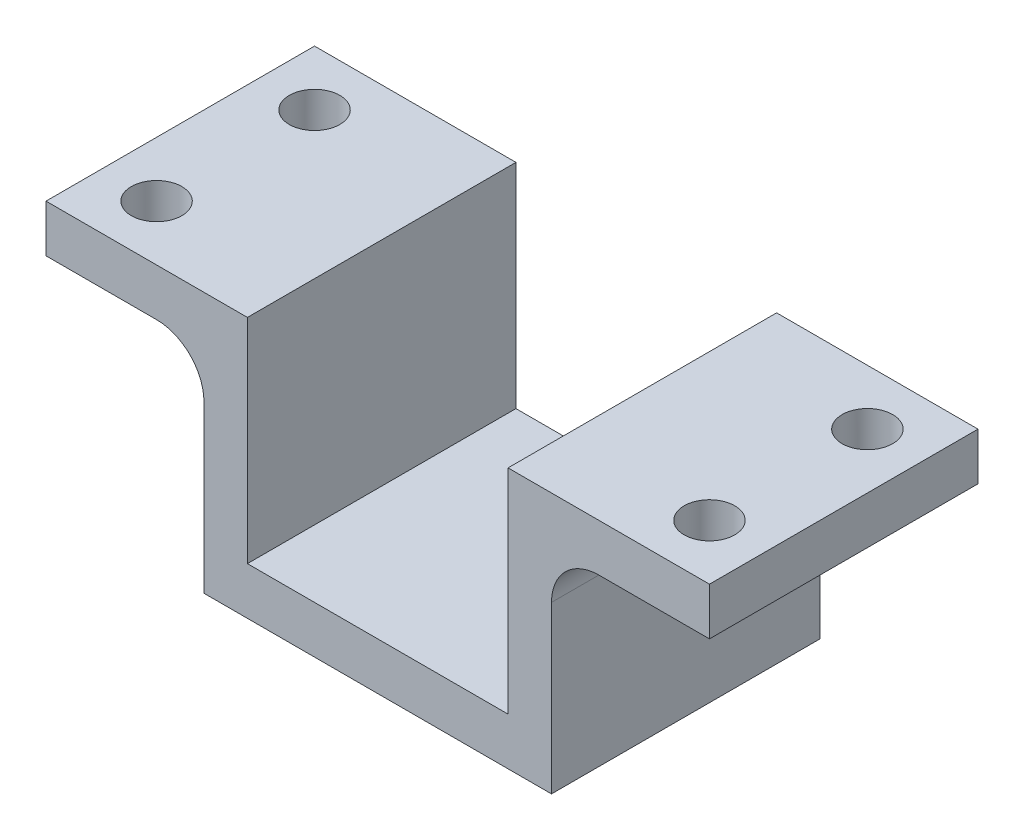
ISO-10303-21;
HEADER;
FILE_DESCRIPTION(('STEP AP214'),'2;1');
FILE_NAME('part.step','',(''),(''),'','','');
FILE_SCHEMA(('AUTOMOTIVE_DESIGN { 1 0 10303 214 1 1 1 1 }'));
ENDSEC;
DATA;
#1=APPLICATION_CONTEXT('core data for automotive mechanical design processes');
#2=APPLICATION_PROTOCOL_DEFINITION('international standard','automotive_design',2000,#1);
#3=PRODUCT_CONTEXT('',#1,'mechanical');
#4=PRODUCT('Part','Part','',(#3));
#5=PRODUCT_RELATED_PRODUCT_CATEGORY('part','',(#4));
#6=PRODUCT_DEFINITION_FORMATION('','',#4);
#7=PRODUCT_DEFINITION_CONTEXT('part definition',#1,'design');
#8=PRODUCT_DEFINITION('design','',#6,#7);
#9=PRODUCT_DEFINITION_SHAPE('','',#8);
#10=(LENGTH_UNIT() NAMED_UNIT(*) SI_UNIT(.MILLI.,.METRE.));
#11=(NAMED_UNIT(*) PLANE_ANGLE_UNIT() SI_UNIT($,.RADIAN.));
#12=(NAMED_UNIT(*) SI_UNIT($,.STERADIAN.) SOLID_ANGLE_UNIT());
#13=UNCERTAINTY_MEASURE_WITH_UNIT(LENGTH_MEASURE(1.E-05),#10,'distance_accuracy_value','');
#14=(GEOMETRIC_REPRESENTATION_CONTEXT(3) GLOBAL_UNCERTAINTY_ASSIGNED_CONTEXT((#13)) GLOBAL_UNIT_ASSIGNED_CONTEXT((#10,
#11,#12)) REPRESENTATION_CONTEXT('',''));
#15=CARTESIAN_POINT('',(0.,0.,0.));
#16=DIRECTION('',(0.,0.,1.));
#17=DIRECTION('',(1.,0.,0.));
#18=AXIS2_PLACEMENT_3D('',#15,#16,#17);
#19=CARTESIAN_POINT('',(0.,3.,0.));
#20=DIRECTION('',(0.,-1.,0.));
#21=DIRECTION('',(0.,0.,-1.));
#22=AXIS2_PLACEMENT_3D('',#19,#20,#21);
#23=PLANE('',#22);
#24=DIRECTION('',(0.,0.,1.));
#25=VECTOR('',#24,1.);
#26=CARTESIAN_POINT('',(8.25,3.,-8.5));
#27=LINE('',#26,#25);
#28=CARTESIAN_POINT('',(8.25,3.,-8.5));
#29=VERTEX_POINT('',#28);
#30=CARTESIAN_POINT('',(8.25,3.,8.5));
#31=VERTEX_POINT('',#30);
#32=EDGE_CURVE('E174',#29,#31,#27,.T.);
#33=ORIENTED_EDGE('',*,*,#32,.F.);
#34=DIRECTION('',(-1.,0.,0.));
#35=VECTOR('',#34,1.);
#36=CARTESIAN_POINT('',(-11.,3.,-8.5));
#37=LINE('',#36,#35);
#38=CARTESIAN_POINT('',(-8.25,3.,-8.5));
#39=VERTEX_POINT('',#38);
#40=EDGE_CURVE('E207',#29,#39,#37,.T.);
#41=ORIENTED_EDGE('',*,*,#40,.T.);
#42=DIRECTION('',(0.,0.,-1.));
#43=VECTOR('',#42,1.);
#44=CARTESIAN_POINT('',(-8.25,3.,-8.5));
#45=LINE('',#44,#43);
#46=CARTESIAN_POINT('',(-8.25,3.,8.5));
#47=VERTEX_POINT('',#46);
#48=EDGE_CURVE('E191',#47,#39,#45,.T.);
#49=ORIENTED_EDGE('',*,*,#48,.F.);
#50=DIRECTION('',(1.,0.,0.));
#51=VECTOR('',#50,1.);
#52=CARTESIAN_POINT('',(-11.,3.,8.5));
#53=LINE('',#52,#51);
#54=EDGE_CURVE('E209',#47,#31,#53,.T.);
#55=ORIENTED_EDGE('',*,*,#54,.T.);
#56=EDGE_LOOP('',(#33,#41,#49,#55));
#57=FACE_BOUND('',#56,.T.);
#58=ADVANCED_FACE('F34',(#57),#23,.F.);
#59=CARTESIAN_POINT('',(11.,3.,8.5));
#60=DIRECTION('',(-1.,0.,0.));
#61=DIRECTION('',(0.,0.,1.));
#62=AXIS2_PLACEMENT_3D('',#59,#60,#61);
#63=PLANE('',#62);
#64=DIRECTION('',(0.,-1.,0.));
#65=VECTOR('',#64,1.);
#66=CARTESIAN_POINT('',(11.,3.,-8.5));
#67=LINE('',#66,#65);
#68=CARTESIAN_POINT('',(11.,10.5,-8.5));
#69=VERTEX_POINT('',#68);
#70=CARTESIAN_POINT('',(11.,0.,-8.5));
#71=VERTEX_POINT('',#70);
#72=EDGE_CURVE('E227',#69,#71,#67,.T.);
#73=ORIENTED_EDGE('',*,*,#72,.F.);
#74=DIRECTION('',(0.,0.,1.));
#75=VECTOR('',#74,1.);
#76=CARTESIAN_POINT('',(11.,10.5,8.5));
#77=LINE('',#76,#75);
#78=CARTESIAN_POINT('',(11.,10.5,8.5));
#79=VERTEX_POINT('',#78);
#80=EDGE_CURVE('E229',#69,#79,#77,.T.);
#81=ORIENTED_EDGE('',*,*,#80,.T.);
#82=DIRECTION('',(0.,-1.,0.));
#83=VECTOR('',#82,1.);
#84=CARTESIAN_POINT('',(11.,3.,8.5));
#85=LINE('',#84,#83);
#86=CARTESIAN_POINT('',(11.,0.,8.5));
#87=VERTEX_POINT('',#86);
#88=EDGE_CURVE('E212',#79,#87,#85,.T.);
#89=ORIENTED_EDGE('',*,*,#88,.T.);
#90=DIRECTION('',(0.,0.,-1.));
#91=VECTOR('',#90,1.);
#92=CARTESIAN_POINT('',(11.,0.,8.5));
#93=LINE('',#92,#91);
#94=EDGE_CURVE('E206',#87,#71,#93,.T.);
#95=ORIENTED_EDGE('',*,*,#94,.T.);
#96=EDGE_LOOP('',(#73,#81,#89,#95));
#97=FACE_BOUND('',#96,.T.);
#98=ADVANCED_FACE('F249',(#97),#63,.F.);
#99=CARTESIAN_POINT('',(-11.,3.,-8.5));
#100=DIRECTION('',(0.,0.,1.));
#101=DIRECTION('',(1.,0.,0.));
#102=AXIS2_PLACEMENT_3D('',#99,#100,#101);
#103=PLANE('',#102);
#104=DIRECTION('',(-1.,0.,0.));
#105=VECTOR('',#104,1.);
#106=CARTESIAN_POINT('',(-11.,0.,-8.5));
#107=LINE('',#106,#105);
#108=CARTESIAN_POINT('',(-11.,0.,-8.5));
#109=VERTEX_POINT('',#108);
#110=EDGE_CURVE('E215',#71,#109,#107,.T.);
#111=ORIENTED_EDGE('',*,*,#110,.T.);
#112=DIRECTION('',(0.,-1.,0.));
#113=VECTOR('',#112,1.);
#114=CARTESIAN_POINT('',(-11.,3.,-8.5));
#115=LINE('',#114,#113);
#116=CARTESIAN_POINT('',(-11.,10.5,-8.5));
#117=VERTEX_POINT('',#116);
#118=EDGE_CURVE('E225',#117,#109,#115,.T.);
#119=ORIENTED_EDGE('',*,*,#118,.F.);
#120=CARTESIAN_POINT('',(-14.,10.5,-8.5));
#121=DIRECTION('',(0.,0.,1.));
#122=DIRECTION('',(1.,0.,0.));
#123=AXIS2_PLACEMENT_3D('',#120,#121,#122);
#124=CIRCLE('',#123,3.);
#125=CARTESIAN_POINT('',(-14.,13.5,-8.5));
#126=VERTEX_POINT('',#125);
#127=EDGE_CURVE('E42',#117,#126,#124,.T.);
#128=ORIENTED_EDGE('',*,*,#127,.T.);
#129=DIRECTION('',(-1.,0.,0.));
#130=VECTOR('',#129,1.);
#131=CARTESIAN_POINT('',(-11.,13.5,-8.5));
#132=LINE('',#131,#130);
#133=CARTESIAN_POINT('',(-21.,13.5,-8.5));
#134=VERTEX_POINT('',#133);
#135=EDGE_CURVE('E132',#126,#134,#132,.T.);
#136=ORIENTED_EDGE('',*,*,#135,.T.);
#137=DIRECTION('',(0.,1.,0.));
#138=VECTOR('',#137,1.);
#139=CARTESIAN_POINT('',(-21.,13.5,-8.5));
#140=LINE('',#139,#138);
#141=CARTESIAN_POINT('',(-21.,16.5,-8.5));
#142=VERTEX_POINT('',#141);
#143=EDGE_CURVE('E137',#134,#142,#140,.T.);
#144=ORIENTED_EDGE('',*,*,#143,.T.);
#145=DIRECTION('',(-1.,0.,0.));
#146=VECTOR('',#145,1.);
#147=CARTESIAN_POINT('',(-11.,16.5,-8.5));
#148=LINE('',#147,#146);
#149=CARTESIAN_POINT('',(-8.25,16.5,-8.5));
#150=VERTEX_POINT('',#149);
#151=EDGE_CURVE('E196',#150,#142,#148,.T.);
#152=ORIENTED_EDGE('',*,*,#151,.F.);
#153=DIRECTION('',(0.,-1.,0.));
#154=VECTOR('',#153,1.);
#155=CARTESIAN_POINT('',(-8.25,16.5,-8.5));
#156=LINE('',#155,#154);
#157=EDGE_CURVE('E198',#150,#39,#156,.T.);
#158=ORIENTED_EDGE('',*,*,#157,.T.);
#159=ORIENTED_EDGE('',*,*,#40,.F.);
#160=DIRECTION('',(0.,-1.,0.));
#161=VECTOR('',#160,1.);
#162=CARTESIAN_POINT('',(8.25,16.5,-8.5));
#163=LINE('',#162,#161);
#164=CARTESIAN_POINT('',(8.25,16.5,-8.5));
#165=VERTEX_POINT('',#164);
#166=EDGE_CURVE('E188',#165,#29,#163,.T.);
#167=ORIENTED_EDGE('',*,*,#166,.F.);
#168=DIRECTION('',(-1.,0.,0.));
#169=VECTOR('',#168,1.);
#170=CARTESIAN_POINT('',(11.,16.5,-8.5));
#171=LINE('',#170,#169);
#172=CARTESIAN_POINT('',(21.,16.5,-8.5));
#173=VERTEX_POINT('',#172);
#174=EDGE_CURVE('E177',#173,#165,#171,.T.);
#175=ORIENTED_EDGE('',*,*,#174,.F.);
#176=DIRECTION('',(0.,1.,0.));
#177=VECTOR('',#176,1.);
#178=CARTESIAN_POINT('',(21.,13.5,-8.5));
#179=LINE('',#178,#177);
#180=CARTESIAN_POINT('',(21.,13.5,-8.5));
#181=VERTEX_POINT('',#180);
#182=EDGE_CURVE('E171',#181,#173,#179,.T.);
#183=ORIENTED_EDGE('',*,*,#182,.F.);
#184=DIRECTION('',(-1.,0.,0.));
#185=VECTOR('',#184,1.);
#186=CARTESIAN_POINT('',(11.,13.5,-8.5));
#187=LINE('',#186,#185);
#188=CARTESIAN_POINT('',(14.,13.5,-8.5));
#189=VERTEX_POINT('',#188);
#190=EDGE_CURVE('E165',#181,#189,#187,.T.);
#191=ORIENTED_EDGE('',*,*,#190,.T.);
#192=CARTESIAN_POINT('',(14.,10.5,-8.5));
#193=DIRECTION('',(0.,0.,1.));
#194=DIRECTION('',(1.,0.,0.));
#195=AXIS2_PLACEMENT_3D('',#192,#193,#194);
#196=CIRCLE('',#195,3.);
#197=EDGE_CURVE('E240',#189,#69,#196,.T.);
#198=ORIENTED_EDGE('',*,*,#197,.T.);
#199=ORIENTED_EDGE('',*,*,#72,.T.);
#200=EDGE_LOOP('',(#111,#119,#128,#136,#144,#152,#158,#159,#167,#175,#183,#191,#198,#199));
#201=FACE_BOUND('',#200,.T.);
#202=ADVANCED_FACE('F135',(#201),#103,.F.);
#203=CARTESIAN_POINT('',(-11.,3.,8.5));
#204=DIRECTION('',(1.,0.,0.));
#205=DIRECTION('',(0.,0.,-1.));
#206=AXIS2_PLACEMENT_3D('',#203,#204,#205);
#207=PLANE('',#206);
#208=DIRECTION('',(0.,-1.,0.));
#209=VECTOR('',#208,1.);
#210=CARTESIAN_POINT('',(-11.,3.,8.5));
#211=LINE('',#210,#209);
#212=CARTESIAN_POINT('',(-11.,10.5,8.5));
#213=VERTEX_POINT('',#212);
#214=CARTESIAN_POINT('',(-11.,0.,8.5));
#215=VERTEX_POINT('',#214);
#216=EDGE_CURVE('E223',#213,#215,#211,.T.);
#217=ORIENTED_EDGE('',*,*,#216,.F.);
#218=DIRECTION('',(0.,0.,-1.));
#219=VECTOR('',#218,1.);
#220=CARTESIAN_POINT('',(-11.,10.5,8.5));
#221=LINE('',#220,#219);
#222=EDGE_CURVE('E234',#213,#117,#221,.T.);
#223=ORIENTED_EDGE('',*,*,#222,.T.);
#224=ORIENTED_EDGE('',*,*,#118,.T.);
#225=DIRECTION('',(0.,0.,1.));
#226=VECTOR('',#225,1.);
#227=CARTESIAN_POINT('',(-11.,0.,8.5));
#228=LINE('',#227,#226);
#229=EDGE_CURVE('E217',#109,#215,#228,.T.);
#230=ORIENTED_EDGE('',*,*,#229,.T.);
#231=EDGE_LOOP('',(#217,#223,#224,#230));
#232=FACE_BOUND('',#231,.T.);
#233=ADVANCED_FACE('F305',(#232),#207,.F.);
#234=CARTESIAN_POINT('',(-11.,3.,8.5));
#235=DIRECTION('',(0.,0.,-1.));
#236=DIRECTION('',(-1.,0.,0.));
#237=AXIS2_PLACEMENT_3D('',#234,#235,#236);
#238=PLANE('',#237);
#239=DIRECTION('',(1.,0.,0.));
#240=VECTOR('',#239,1.);
#241=CARTESIAN_POINT('',(-11.,0.,8.5));
#242=LINE('',#241,#240);
#243=EDGE_CURVE('E210',#215,#87,#242,.T.);
#244=ORIENTED_EDGE('',*,*,#243,.T.);
#245=ORIENTED_EDGE('',*,*,#88,.F.);
#246=CARTESIAN_POINT('',(14.,10.5,8.5));
#247=DIRECTION('',(0.,0.,-1.));
#248=DIRECTION('',(-1.,0.,0.));
#249=AXIS2_PLACEMENT_3D('',#246,#247,#248);
#250=CIRCLE('',#249,3.);
#251=CARTESIAN_POINT('',(14.,13.5,8.5));
#252=VERTEX_POINT('',#251);
#253=EDGE_CURVE('E238',#79,#252,#250,.T.);
#254=ORIENTED_EDGE('',*,*,#253,.T.);
#255=DIRECTION('',(1.,0.,0.));
#256=VECTOR('',#255,1.);
#257=CARTESIAN_POINT('',(11.,13.5,8.5));
#258=LINE('',#257,#256);
#259=CARTESIAN_POINT('',(21.,13.5,8.5));
#260=VERTEX_POINT('',#259);
#261=EDGE_CURVE('E160',#252,#260,#258,.T.);
#262=ORIENTED_EDGE('',*,*,#261,.T.);
#263=DIRECTION('',(0.,1.,0.));
#264=VECTOR('',#263,1.);
#265=CARTESIAN_POINT('',(21.,13.5,8.5));
#266=LINE('',#265,#264);
#267=CARTESIAN_POINT('',(21.,16.5,8.5));
#268=VERTEX_POINT('',#267);
#269=EDGE_CURVE('E168',#260,#268,#266,.T.);
#270=ORIENTED_EDGE('',*,*,#269,.T.);
#271=DIRECTION('',(1.,0.,0.));
#272=VECTOR('',#271,1.);
#273=CARTESIAN_POINT('',(11.,16.5,8.5));
#274=LINE('',#273,#272);
#275=CARTESIAN_POINT('',(8.25,16.5,8.5));
#276=VERTEX_POINT('',#275);
#277=EDGE_CURVE('E181',#276,#268,#274,.T.);
#278=ORIENTED_EDGE('',*,*,#277,.F.);
#279=DIRECTION('',(0.,-1.,0.));
#280=VECTOR('',#279,1.);
#281=CARTESIAN_POINT('',(8.25,16.5,8.5));
#282=LINE('',#281,#280);
#283=EDGE_CURVE('E183',#276,#31,#282,.T.);
#284=ORIENTED_EDGE('',*,*,#283,.T.);
#285=ORIENTED_EDGE('',*,*,#54,.F.);
#286=DIRECTION('',(0.,-1.,0.));
#287=VECTOR('',#286,1.);
#288=CARTESIAN_POINT('',(-8.25,16.5,8.5));
#289=LINE('',#288,#287);
#290=CARTESIAN_POINT('',(-8.25,16.5,8.5));
#291=VERTEX_POINT('',#290);
#292=EDGE_CURVE('E203',#291,#47,#289,.T.);
#293=ORIENTED_EDGE('',*,*,#292,.F.);
#294=DIRECTION('',(1.,0.,0.));
#295=VECTOR('',#294,1.);
#296=CARTESIAN_POINT('',(-11.,16.5,8.5));
#297=LINE('',#296,#295);
#298=CARTESIAN_POINT('',(-21.,16.5,8.5));
#299=VERTEX_POINT('',#298);
#300=EDGE_CURVE('E192',#299,#291,#297,.T.);
#301=ORIENTED_EDGE('',*,*,#300,.F.);
#302=DIRECTION('',(0.,1.,0.));
#303=VECTOR('',#302,1.);
#304=CARTESIAN_POINT('',(-21.,13.5,8.5));
#305=LINE('',#304,#303);
#306=CARTESIAN_POINT('',(-21.,13.5,8.5));
#307=VERTEX_POINT('',#306);
#308=EDGE_CURVE('E148',#307,#299,#305,.T.);
#309=ORIENTED_EDGE('',*,*,#308,.F.);
#310=DIRECTION('',(1.,0.,0.));
#311=VECTOR('',#310,1.);
#312=CARTESIAN_POINT('',(-11.,13.5,8.5));
#313=LINE('',#312,#311);
#314=CARTESIAN_POINT('',(-14.,13.5,8.5));
#315=VERTEX_POINT('',#314);
#316=EDGE_CURVE('E149',#307,#315,#313,.T.);
#317=ORIENTED_EDGE('',*,*,#316,.T.);
#318=CARTESIAN_POINT('',(-14.,10.5,8.5));
#319=DIRECTION('',(0.,0.,-1.));
#320=DIRECTION('',(-1.,0.,0.));
#321=AXIS2_PLACEMENT_3D('',#318,#319,#320);
#322=CIRCLE('',#321,3.);
#323=EDGE_CURVE('E11',#315,#213,#322,.T.);
#324=ORIENTED_EDGE('',*,*,#323,.T.);
#325=ORIENTED_EDGE('',*,*,#216,.T.);
#326=EDGE_LOOP('',(#244,#245,#254,#262,#270,#278,#284,#285,#293,#301,#309,#317,#324,#325));
#327=FACE_BOUND('',#326,.T.);
#328=ADVANCED_FACE('F255',(#327),#238,.F.);
#329=CARTESIAN_POINT('',(0.,0.,0.));
#330=DIRECTION('',(0.,-1.,0.));
#331=DIRECTION('',(0.,0.,-1.));
#332=AXIS2_PLACEMENT_3D('',#329,#330,#331);
#333=PLANE('',#332);
#334=ORIENTED_EDGE('',*,*,#94,.F.);
#335=ORIENTED_EDGE('',*,*,#243,.F.);
#336=ORIENTED_EDGE('',*,*,#229,.F.);
#337=ORIENTED_EDGE('',*,*,#110,.F.);
#338=EDGE_LOOP('',(#334,#335,#336,#337));
#339=FACE_BOUND('',#338,.T.);
#340=ADVANCED_FACE('F289',(#339),#333,.T.);
#341=CARTESIAN_POINT('',(-8.25,16.5,-8.5));
#342=DIRECTION('',(-1.,0.,0.));
#343=DIRECTION('',(0.,0.,1.));
#344=AXIS2_PLACEMENT_3D('',#341,#342,#343);
#345=PLANE('',#344);
#346=ORIENTED_EDGE('',*,*,#48,.T.);
#347=ORIENTED_EDGE('',*,*,#157,.F.);
#348=DIRECTION('',(0.,0.,-1.));
#349=VECTOR('',#348,1.);
#350=CARTESIAN_POINT('',(-8.25,16.5,-8.5));
#351=LINE('',#350,#349);
#352=EDGE_CURVE('E194',#291,#150,#351,.T.);
#353=ORIENTED_EDGE('',*,*,#352,.F.);
#354=ORIENTED_EDGE('',*,*,#292,.T.);
#355=EDGE_LOOP('',(#346,#347,#353,#354));
#356=FACE_BOUND('',#355,.T.);
#357=ADVANCED_FACE('F277',(#356),#345,.F.);
#358=CARTESIAN_POINT('',(0.,16.5,0.));
#359=DIRECTION('',(0.,1.,0.));
#360=DIRECTION('',(0.,0.,1.));
#361=AXIS2_PLACEMENT_3D('',#358,#359,#360);
#362=PLANE('',#361);
#363=CARTESIAN_POINT('',(-17.5,16.5,5.));
#364=DIRECTION('',(0.,1.,0.));
#365=DIRECTION('',(0.,0.,-1.));
#366=AXIS2_PLACEMENT_3D('',#363,#364,#365);
#367=CIRCLE('',#366,1.6);
#368=CARTESIAN_POINT('',(-17.5,16.5,3.4));
#369=VERTEX_POINT('',#368);
#370=EDGE_CURVE('E369',#369,#369,#367,.T.);
#371=ORIENTED_EDGE('',*,*,#370,.F.);
#372=EDGE_LOOP('',(#371));
#373=FACE_BOUND('',#372,.T.);
#374=CARTESIAN_POINT('',(-17.5,16.5,-5.));
#375=DIRECTION('',(0.,1.,0.));
#376=DIRECTION('',(0.,0.,1.));
#377=AXIS2_PLACEMENT_3D('',#374,#375,#376);
#378=CIRCLE('',#377,1.6);
#379=CARTESIAN_POINT('',(-17.5,16.5,-3.4));
#380=VERTEX_POINT('',#379);
#381=EDGE_CURVE('E157',#380,#380,#378,.T.);
#382=ORIENTED_EDGE('',*,*,#381,.F.);
#383=EDGE_LOOP('',(#382));
#384=FACE_BOUND('',#383,.T.);
#385=ORIENTED_EDGE('',*,*,#151,.T.);
#386=DIRECTION('',(0.,0.,1.));
#387=VECTOR('',#386,1.);
#388=CARTESIAN_POINT('',(-21.,16.5,-8.5));
#389=LINE('',#388,#387);
#390=EDGE_CURVE('E141',#142,#299,#389,.T.);
#391=ORIENTED_EDGE('',*,*,#390,.T.);
#392=ORIENTED_EDGE('',*,*,#300,.T.);
#393=ORIENTED_EDGE('',*,*,#352,.T.);
#394=EDGE_LOOP('',(#385,#391,#392,#393));
#395=FACE_BOUND('',#394,.T.);
#396=ADVANCED_FACE('F280',(#373,#384,#395),#362,.T.);
#397=CARTESIAN_POINT('',(8.25,16.5,-8.5));
#398=DIRECTION('',(1.,0.,0.));
#399=DIRECTION('',(0.,0.,-1.));
#400=AXIS2_PLACEMENT_3D('',#397,#398,#399);
#401=PLANE('',#400);
#402=ORIENTED_EDGE('',*,*,#32,.T.);
#403=ORIENTED_EDGE('',*,*,#283,.F.);
#404=DIRECTION('',(0.,0.,1.));
#405=VECTOR('',#404,1.);
#406=CARTESIAN_POINT('',(8.25,16.5,-8.5));
#407=LINE('',#406,#405);
#408=EDGE_CURVE('E179',#165,#276,#407,.T.);
#409=ORIENTED_EDGE('',*,*,#408,.F.);
#410=ORIENTED_EDGE('',*,*,#166,.T.);
#411=EDGE_LOOP('',(#402,#403,#409,#410));
#412=FACE_BOUND('',#411,.T.);
#413=ADVANCED_FACE('F271',(#412),#401,.F.);
#414=CARTESIAN_POINT('',(0.,16.5,0.));
#415=DIRECTION('',(0.,-1.,0.));
#416=DIRECTION('',(0.,0.,-1.));
#417=AXIS2_PLACEMENT_3D('',#414,#415,#416);
#418=PLANE('',#417);
#419=CARTESIAN_POINT('',(17.5,16.5,-5.));
#420=DIRECTION('',(0.,1.,0.));
#421=DIRECTION('',(0.,0.,-1.));
#422=AXIS2_PLACEMENT_3D('',#419,#420,#421);
#423=CIRCLE('',#422,1.6);
#424=CARTESIAN_POINT('',(17.5,16.5,-6.6));
#425=VERTEX_POINT('',#424);
#426=EDGE_CURVE('E350',#425,#425,#423,.T.);
#427=ORIENTED_EDGE('',*,*,#426,.F.);
#428=EDGE_LOOP('',(#427));
#429=FACE_BOUND('',#428,.T.);
#430=CARTESIAN_POINT('',(17.5,16.5,5.));
#431=DIRECTION('',(0.,1.,0.));
#432=DIRECTION('',(0.,0.,1.));
#433=AXIS2_PLACEMENT_3D('',#430,#431,#432);
#434=CIRCLE('',#433,1.6);
#435=CARTESIAN_POINT('',(17.5,16.5,6.6));
#436=VERTEX_POINT('',#435);
#437=EDGE_CURVE('E353',#436,#436,#434,.T.);
#438=ORIENTED_EDGE('',*,*,#437,.F.);
#439=EDGE_LOOP('',(#438));
#440=FACE_BOUND('',#439,.T.);
#441=ORIENTED_EDGE('',*,*,#277,.T.);
#442=DIRECTION('',(0.,0.,-1.));
#443=VECTOR('',#442,1.);
#444=CARTESIAN_POINT('',(21.,16.5,-8.5));
#445=LINE('',#444,#443);
#446=EDGE_CURVE('E158',#268,#173,#445,.T.);
#447=ORIENTED_EDGE('',*,*,#446,.T.);
#448=ORIENTED_EDGE('',*,*,#174,.T.);
#449=ORIENTED_EDGE('',*,*,#408,.T.);
#450=EDGE_LOOP('',(#441,#447,#448,#449));
#451=FACE_BOUND('',#450,.T.);
#452=ADVANCED_FACE('F267',(#429,#440,#451),#418,.F.);
#453=CARTESIAN_POINT('',(21.,13.5,-8.5));
#454=DIRECTION('',(1.,0.,0.));
#455=DIRECTION('',(0.,0.,-1.));
#456=AXIS2_PLACEMENT_3D('',#453,#454,#455);
#457=PLANE('',#456);
#458=ORIENTED_EDGE('',*,*,#446,.F.);
#459=ORIENTED_EDGE('',*,*,#269,.F.);
#460=DIRECTION('',(0.,0.,-1.));
#461=VECTOR('',#460,1.);
#462=CARTESIAN_POINT('',(21.,13.5,-8.5));
#463=LINE('',#462,#461);
#464=EDGE_CURVE('E162',#260,#181,#463,.T.);
#465=ORIENTED_EDGE('',*,*,#464,.T.);
#466=ORIENTED_EDGE('',*,*,#182,.T.);
#467=EDGE_LOOP('',(#458,#459,#465,#466));
#468=FACE_BOUND('',#467,.T.);
#469=ADVANCED_FACE('F262',(#468),#457,.T.);
#470=CARTESIAN_POINT('',(0.,13.5,0.));
#471=DIRECTION('',(0.,1.,0.));
#472=DIRECTION('',(0.,0.,1.));
#473=AXIS2_PLACEMENT_3D('',#470,#471,#472);
#474=PLANE('',#473);
#475=CARTESIAN_POINT('',(17.5,13.5,-5.));
#476=DIRECTION('',(0.,1.,0.));
#477=DIRECTION('',(0.,0.,1.));
#478=AXIS2_PLACEMENT_3D('',#475,#476,#477);
#479=CIRCLE('',#478,1.6);
#480=CARTESIAN_POINT('',(17.5,13.5,-3.4));
#481=VERTEX_POINT('',#480);
#482=EDGE_CURVE('E355',#481,#481,#479,.F.);
#483=ORIENTED_EDGE('',*,*,#482,.F.);
#484=EDGE_LOOP('',(#483));
#485=FACE_BOUND('',#484,.T.);
#486=CARTESIAN_POINT('',(17.5,13.5,5.));
#487=DIRECTION('',(0.,1.,0.));
#488=DIRECTION('',(0.,0.,1.));
#489=AXIS2_PLACEMENT_3D('',#486,#487,#488);
#490=CIRCLE('',#489,1.6);
#491=CARTESIAN_POINT('',(17.5,13.5,6.6));
#492=VERTEX_POINT('',#491);
#493=EDGE_CURVE('E354',#492,#492,#490,.F.);
#494=ORIENTED_EDGE('',*,*,#493,.F.);
#495=EDGE_LOOP('',(#494));
#496=FACE_BOUND('',#495,.T.);
#497=ORIENTED_EDGE('',*,*,#261,.F.);
#498=DIRECTION('',(0.,0.,1.));
#499=VECTOR('',#498,1.);
#500=CARTESIAN_POINT('',(14.,13.5,-8.5));
#501=LINE('',#500,#499);
#502=EDGE_CURVE('E232',#252,#189,#501,.F.);
#503=ORIENTED_EDGE('',*,*,#502,.T.);
#504=ORIENTED_EDGE('',*,*,#190,.F.);
#505=ORIENTED_EDGE('',*,*,#464,.F.);
#506=EDGE_LOOP('',(#497,#503,#504,#505));
#507=FACE_BOUND('',#506,.T.);
#508=ADVANCED_FACE('F259',(#485,#496,#507),#474,.F.);
#509=CARTESIAN_POINT('',(-21.,13.5,-8.5));
#510=DIRECTION('',(-1.,0.,0.));
#511=DIRECTION('',(0.,0.,1.));
#512=AXIS2_PLACEMENT_3D('',#509,#510,#511);
#513=PLANE('',#512);
#514=ORIENTED_EDGE('',*,*,#390,.F.);
#515=ORIENTED_EDGE('',*,*,#143,.F.);
#516=DIRECTION('',(0.,0.,1.));
#517=VECTOR('',#516,1.);
#518=CARTESIAN_POINT('',(-21.,13.5,-8.5));
#519=LINE('',#518,#517);
#520=EDGE_CURVE('E140',#134,#307,#519,.T.);
#521=ORIENTED_EDGE('',*,*,#520,.T.);
#522=ORIENTED_EDGE('',*,*,#308,.T.);
#523=EDGE_LOOP('',(#514,#515,#521,#522));
#524=FACE_BOUND('',#523,.T.);
#525=ADVANCED_FACE('F145',(#524),#513,.T.);
#526=CARTESIAN_POINT('',(0.,13.5,0.));
#527=DIRECTION('',(0.,-1.,0.));
#528=DIRECTION('',(0.,0.,-1.));
#529=AXIS2_PLACEMENT_3D('',#526,#527,#528);
#530=PLANE('',#529);
#531=CARTESIAN_POINT('',(-17.5,13.5,5.));
#532=DIRECTION('',(0.,-1.,0.));
#533=DIRECTION('',(0.,0.,-1.));
#534=AXIS2_PLACEMENT_3D('',#531,#532,#533);
#535=CIRCLE('',#534,1.6);
#536=CARTESIAN_POINT('',(-17.5,13.5,3.4));
#537=VERTEX_POINT('',#536);
#538=EDGE_CURVE('E358',#537,#537,#535,.F.);
#539=ORIENTED_EDGE('',*,*,#538,.T.);
#540=EDGE_LOOP('',(#539));
#541=FACE_BOUND('',#540,.T.);
#542=CARTESIAN_POINT('',(-17.5,13.5,-5.));
#543=DIRECTION('',(0.,-1.,0.));
#544=DIRECTION('',(0.,0.,-1.));
#545=AXIS2_PLACEMENT_3D('',#542,#543,#544);
#546=CIRCLE('',#545,1.6);
#547=CARTESIAN_POINT('',(-17.5,13.5,-6.6));
#548=VERTEX_POINT('',#547);
#549=EDGE_CURVE('E367',#548,#548,#546,.F.);
#550=ORIENTED_EDGE('',*,*,#549,.T.);
#551=EDGE_LOOP('',(#550));
#552=FACE_BOUND('',#551,.T.);
#553=ORIENTED_EDGE('',*,*,#135,.F.);
#554=DIRECTION('',(0.,0.,-1.));
#555=VECTOR('',#554,1.);
#556=CARTESIAN_POINT('',(-14.,13.5,0.));
#557=LINE('',#556,#555);
#558=EDGE_CURVE('E55',#126,#315,#557,.F.);
#559=ORIENTED_EDGE('',*,*,#558,.T.);
#560=ORIENTED_EDGE('',*,*,#316,.F.);
#561=ORIENTED_EDGE('',*,*,#520,.F.);
#562=EDGE_LOOP('',(#553,#559,#560,#561));
#563=FACE_BOUND('',#562,.T.);
#564=ADVANCED_FACE('F151',(#541,#552,#563),#530,.T.);
#565=CARTESIAN_POINT('',(-17.5,-0.001000000000001,-5.));
#566=DIRECTION('',(0.,1.,0.));
#567=DIRECTION('',(0.,0.,1.));
#568=AXIS2_PLACEMENT_3D('',#565,#566,#567);
#569=CYLINDRICAL_SURFACE('',#568,1.6);
#570=ORIENTED_EDGE('',*,*,#549,.F.);
#571=EDGE_LOOP('',(#570));
#572=FACE_BOUND('',#571,.T.);
#573=ORIENTED_EDGE('',*,*,#381,.T.);
#574=EDGE_LOOP('',(#573));
#575=FACE_BOUND('',#574,.T.);
#576=ADVANCED_FACE('F330',(#572,#575),#569,.F.);
#577=CARTESIAN_POINT('',(-17.5,-0.001000000000001,5.));
#578=DIRECTION('',(0.,1.,0.));
#579=DIRECTION('',(0.,0.,1.));
#580=AXIS2_PLACEMENT_3D('',#577,#578,#579);
#581=CYLINDRICAL_SURFACE('',#580,1.6);
#582=ORIENTED_EDGE('',*,*,#538,.F.);
#583=EDGE_LOOP('',(#582));
#584=FACE_BOUND('',#583,.T.);
#585=ORIENTED_EDGE('',*,*,#370,.T.);
#586=EDGE_LOOP('',(#585));
#587=FACE_BOUND('',#586,.T.);
#588=ADVANCED_FACE('F323',(#584,#587),#581,.F.);
#589=CARTESIAN_POINT('',(17.5,-0.001000000000001,5.));
#590=DIRECTION('',(0.,1.,0.));
#591=DIRECTION('',(0.,0.,1.));
#592=AXIS2_PLACEMENT_3D('',#589,#590,#591);
#593=CYLINDRICAL_SURFACE('',#592,1.6);
#594=ORIENTED_EDGE('',*,*,#437,.T.);
#595=EDGE_LOOP('',(#594));
#596=FACE_BOUND('',#595,.T.);
#597=ORIENTED_EDGE('',*,*,#493,.T.);
#598=EDGE_LOOP('',(#597));
#599=FACE_BOUND('',#598,.T.);
#600=ADVANCED_FACE('F317',(#596,#599),#593,.F.);
#601=CARTESIAN_POINT('',(17.5,-0.001000000000001,-5.));
#602=DIRECTION('',(0.,1.,0.));
#603=DIRECTION('',(0.,0.,1.));
#604=AXIS2_PLACEMENT_3D('',#601,#602,#603);
#605=CYLINDRICAL_SURFACE('',#604,1.6);
#606=ORIENTED_EDGE('',*,*,#426,.T.);
#607=EDGE_LOOP('',(#606));
#608=FACE_BOUND('',#607,.T.);
#609=ORIENTED_EDGE('',*,*,#482,.T.);
#610=EDGE_LOOP('',(#609));
#611=FACE_BOUND('',#610,.T.);
#612=ADVANCED_FACE('F311',(#608,#611),#605,.F.);
#613=CARTESIAN_POINT('',(14.,10.5,8.5));
#614=DIRECTION('',(0.,0.,-1.));
#615=DIRECTION('',(-1.,0.,0.));
#616=AXIS2_PLACEMENT_3D('',#613,#614,#615);
#617=CYLINDRICAL_SURFACE('',#616,3.);
#618=ORIENTED_EDGE('',*,*,#197,.F.);
#619=ORIENTED_EDGE('',*,*,#502,.F.);
#620=ORIENTED_EDGE('',*,*,#253,.F.);
#621=ORIENTED_EDGE('',*,*,#80,.F.);
#622=EDGE_LOOP('',(#618,#619,#620,#621));
#623=FACE_BOUND('',#622,.T.);
#624=ADVANCED_FACE('F252',(#623),#617,.F.);
#625=CARTESIAN_POINT('',(-14.,10.5,8.5));
#626=DIRECTION('',(0.,0.,-1.));
#627=DIRECTION('',(-1.,0.,0.));
#628=AXIS2_PLACEMENT_3D('',#625,#626,#627);
#629=CYLINDRICAL_SURFACE('',#628,3.);
#630=ORIENTED_EDGE('',*,*,#323,.F.);
#631=ORIENTED_EDGE('',*,*,#558,.F.);
#632=ORIENTED_EDGE('',*,*,#127,.F.);
#633=ORIENTED_EDGE('',*,*,#222,.F.);
#634=EDGE_LOOP('',(#630,#631,#632,#633));
#635=FACE_BOUND('',#634,.T.);
#636=ADVANCED_FACE('F36',(#635),#629,.F.);
#637=CLOSED_SHELL('',(#58,#98,#202,#233,#328,#340,#357,#396,#413,#452,#469,#508,#525,#564,#576,
#588,#600,#612,#624,#636));
#638=MANIFOLD_SOLID_BREP('B2',#637);
#639=ADVANCED_BREP_SHAPE_REPRESENTATION('',(#18,#638),#14);
#640=SHAPE_DEFINITION_REPRESENTATION(#9,#639);
ENDSEC;
END-ISO-10303-21;
